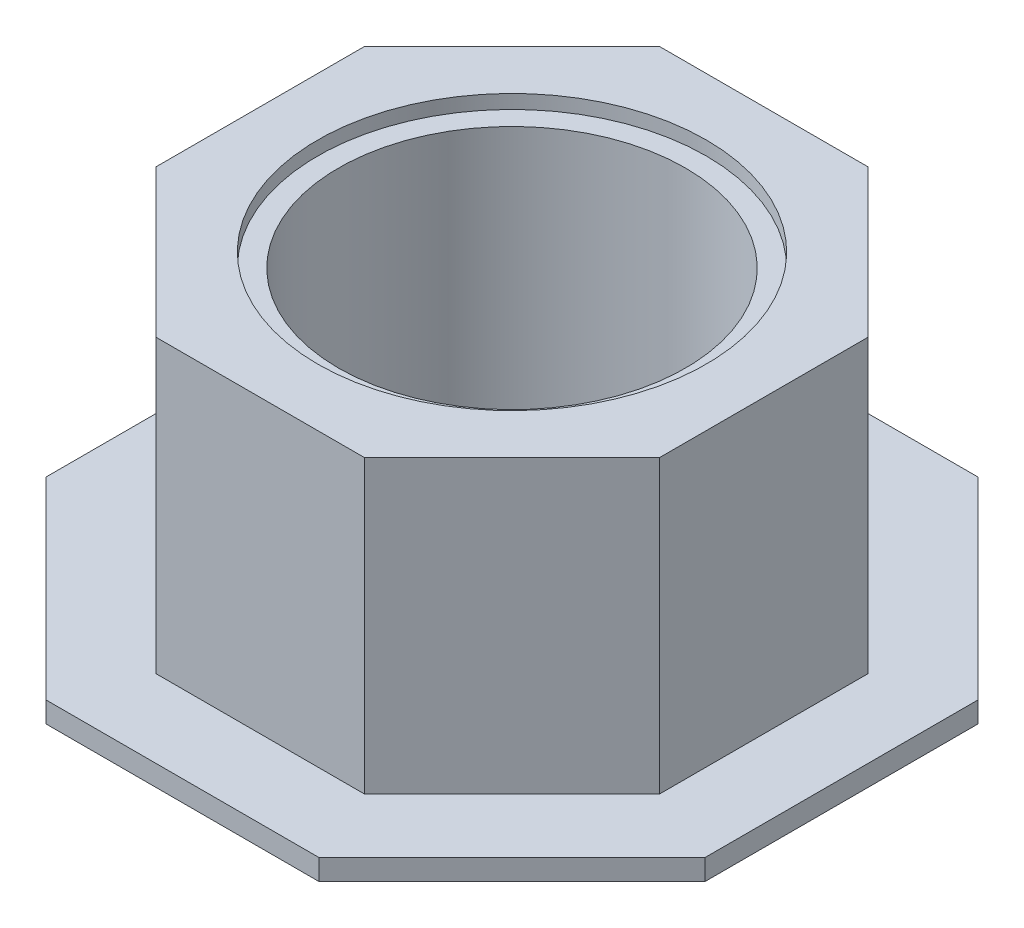
ISO-10303-21;
HEADER;
FILE_DESCRIPTION(('STEP AP214'),'2;1');
FILE_NAME('part.step','',(''),(''),'','','');
FILE_SCHEMA(('AUTOMOTIVE_DESIGN { 1 0 10303 214 1 1 1 1 }'));
ENDSEC;
DATA;
#1=APPLICATION_CONTEXT('core data for automotive mechanical design processes');
#2=APPLICATION_PROTOCOL_DEFINITION('international standard','automotive_design',2000,#1);
#3=PRODUCT_CONTEXT('',#1,'mechanical');
#4=PRODUCT('Part','Part','',(#3));
#5=PRODUCT_RELATED_PRODUCT_CATEGORY('part','',(#4));
#6=PRODUCT_DEFINITION_FORMATION('','',#4);
#7=PRODUCT_DEFINITION_CONTEXT('part definition',#1,'design');
#8=PRODUCT_DEFINITION('design','',#6,#7);
#9=PRODUCT_DEFINITION_SHAPE('','',#8);
#10=(LENGTH_UNIT() NAMED_UNIT(*) SI_UNIT(.MILLI.,.METRE.));
#11=(NAMED_UNIT(*) PLANE_ANGLE_UNIT() SI_UNIT($,.RADIAN.));
#12=(NAMED_UNIT(*) SI_UNIT($,.STERADIAN.) SOLID_ANGLE_UNIT());
#13=UNCERTAINTY_MEASURE_WITH_UNIT(LENGTH_MEASURE(1.E-05),#10,'distance_accuracy_value','');
#14=(GEOMETRIC_REPRESENTATION_CONTEXT(3) GLOBAL_UNCERTAINTY_ASSIGNED_CONTEXT((#13)) GLOBAL_UNIT_ASSIGNED_CONTEXT((#10,
#11,#12)) REPRESENTATION_CONTEXT('',''));
#15=CARTESIAN_POINT('',(0.,0.,0.));
#16=DIRECTION('',(0.,0.,1.));
#17=DIRECTION('',(1.,0.,0.));
#18=AXIS2_PLACEMENT_3D('',#15,#16,#17);
#19=CARTESIAN_POINT('',(0.,0.,0.));
#20=DIRECTION('',(0.,1.,0.));
#21=DIRECTION('',(0.,0.,1.));
#22=AXIS2_PLACEMENT_3D('',#19,#20,#21);
#23=PLANE('',#22);
#24=DIRECTION('',(1.,0.,0.));
#25=VECTOR('',#24,1.);
#26=CARTESIAN_POINT('',(-39.35,0.,94.9993036793813));
#27=LINE('',#26,#25);
#28=CARTESIAN_POINT('',(-39.35,0.,94.9993036793813));
#29=VERTEX_POINT('',#28);
#30=CARTESIAN_POINT('',(39.35,0.,94.9993036793813));
#31=VERTEX_POINT('',#30);
#32=EDGE_CURVE('E157',#29,#31,#27,.T.);
#33=ORIENTED_EDGE('',*,*,#32,.T.);
#34=DIRECTION('',(0.707106781186547,0.,-0.707106781186548));
#35=VECTOR('',#34,1.);
#36=CARTESIAN_POINT('',(39.35,0.,94.9993036793813));
#37=LINE('',#36,#35);
#38=CARTESIAN_POINT('',(94.9993036793813,0.,39.35));
#39=VERTEX_POINT('',#38);
#40=EDGE_CURVE('E161',#31,#39,#37,.T.);
#41=ORIENTED_EDGE('',*,*,#40,.T.);
#42=DIRECTION('',(0.,0.,-1.));
#43=VECTOR('',#42,1.);
#44=CARTESIAN_POINT('',(94.9993036793813,0.,39.35));
#45=LINE('',#44,#43);
#46=CARTESIAN_POINT('',(94.9993036793813,0.,-39.35));
#47=VERTEX_POINT('',#46);
#48=EDGE_CURVE('E166',#39,#47,#45,.T.);
#49=ORIENTED_EDGE('',*,*,#48,.T.);
#50=DIRECTION('',(-0.707106781186548,0.,-0.707106781186547));
#51=VECTOR('',#50,1.);
#52=CARTESIAN_POINT('',(94.9993036793813,0.,-39.35));
#53=LINE('',#52,#51);
#54=CARTESIAN_POINT('',(39.35,0.,-94.9993036793813));
#55=VERTEX_POINT('',#54);
#56=EDGE_CURVE('E170',#47,#55,#53,.T.);
#57=ORIENTED_EDGE('',*,*,#56,.T.);
#58=DIRECTION('',(-1.,0.,0.));
#59=VECTOR('',#58,1.);
#60=CARTESIAN_POINT('',(39.35,0.,-94.9993036793813));
#61=LINE('',#60,#59);
#62=CARTESIAN_POINT('',(-39.35,0.,-94.9993036793813));
#63=VERTEX_POINT('',#62);
#64=EDGE_CURVE('E174',#55,#63,#61,.T.);
#65=ORIENTED_EDGE('',*,*,#64,.T.);
#66=DIRECTION('',(-0.707106781186548,0.,0.707106781186548));
#67=VECTOR('',#66,1.);
#68=CARTESIAN_POINT('',(-39.35,0.,-94.9993036793813));
#69=LINE('',#68,#67);
#70=CARTESIAN_POINT('',(-94.9993036793813,0.,-39.35));
#71=VERTEX_POINT('',#70);
#72=EDGE_CURVE('E178',#63,#71,#69,.T.);
#73=ORIENTED_EDGE('',*,*,#72,.T.);
#74=DIRECTION('',(0.,0.,1.));
#75=VECTOR('',#74,1.);
#76=CARTESIAN_POINT('',(-94.9993036793813,0.,-39.35));
#77=LINE('',#76,#75);
#78=CARTESIAN_POINT('',(-94.9993036793813,0.,39.35));
#79=VERTEX_POINT('',#78);
#80=EDGE_CURVE('E128',#71,#79,#77,.T.);
#81=ORIENTED_EDGE('',*,*,#80,.T.);
#82=DIRECTION('',(0.707106781186547,0.,0.707106781186547));
#83=VECTOR('',#82,1.);
#84=CARTESIAN_POINT('',(-94.9993036793813,0.,39.35));
#85=LINE('',#84,#83);
#86=EDGE_CURVE('E183',#79,#29,#85,.T.);
#87=ORIENTED_EDGE('',*,*,#86,.T.);
#88=EDGE_LOOP('',(#33,#41,#49,#57,#65,#73,#81,#87));
#89=FACE_BOUND('',#88,.T.);
#90=DIRECTION('',(1.,0.,0.));
#91=VECTOR('',#90,1.);
#92=CARTESIAN_POINT('',(0.,0.,72.59));
#93=LINE('',#92,#91);
#94=CARTESIAN_POINT('',(-30.067762492663,0.,72.59));
#95=VERTEX_POINT('',#94);
#96=CARTESIAN_POINT('',(30.067762492663,0.,72.59));
#97=VERTEX_POINT('',#96);
#98=EDGE_CURVE('E288',#95,#97,#93,.T.);
#99=ORIENTED_EDGE('',*,*,#98,.F.);
#100=DIRECTION('',(0.707106781186548,0.,0.707106781186547));
#101=VECTOR('',#100,1.);
#102=CARTESIAN_POINT('',(-51.3288812463315,0.,51.3288812463315));
#103=LINE('',#102,#101);
#104=CARTESIAN_POINT('',(-72.59,0.,30.067762492663));
#105=VERTEX_POINT('',#104);
#106=EDGE_CURVE('E249',#105,#95,#103,.T.);
#107=ORIENTED_EDGE('',*,*,#106,.F.);
#108=DIRECTION('',(0.,0.,1.));
#109=VECTOR('',#108,1.);
#110=CARTESIAN_POINT('',(-72.59,0.,0.));
#111=LINE('',#110,#109);
#112=CARTESIAN_POINT('',(-72.59,0.,-30.067762492663));
#113=VERTEX_POINT('',#112);
#114=EDGE_CURVE('E256',#113,#105,#111,.T.);
#115=ORIENTED_EDGE('',*,*,#114,.F.);
#116=DIRECTION('',(-0.707106781186547,0.,0.707106781186548));
#117=VECTOR('',#116,1.);
#118=CARTESIAN_POINT('',(-51.3288812463315,0.,-51.3288812463315));
#119=LINE('',#118,#117);
#120=CARTESIAN_POINT('',(-30.067762492663,0.,-72.59));
#121=VERTEX_POINT('',#120);
#122=EDGE_CURVE('E308',#121,#113,#119,.T.);
#123=ORIENTED_EDGE('',*,*,#122,.F.);
#124=DIRECTION('',(-1.,0.,0.));
#125=VECTOR('',#124,1.);
#126=CARTESIAN_POINT('',(0.,0.,-72.59));
#127=LINE('',#126,#125);
#128=CARTESIAN_POINT('',(30.0677624926629,0.,-72.59));
#129=VERTEX_POINT('',#128);
#130=EDGE_CURVE('E304',#129,#121,#127,.T.);
#131=ORIENTED_EDGE('',*,*,#130,.F.);
#132=DIRECTION('',(-0.707106781186548,0.,-0.707106781186548));
#133=VECTOR('',#132,1.);
#134=CARTESIAN_POINT('',(51.3288812463315,0.,-51.3288812463315));
#135=LINE('',#134,#133);
#136=CARTESIAN_POINT('',(72.59,0.,-30.067762492663));
#137=VERTEX_POINT('',#136);
#138=EDGE_CURVE('E300',#137,#129,#135,.T.);
#139=ORIENTED_EDGE('',*,*,#138,.F.);
#140=DIRECTION('',(0.,0.,-1.));
#141=VECTOR('',#140,1.);
#142=CARTESIAN_POINT('',(72.59,0.,0.));
#143=LINE('',#142,#141);
#144=CARTESIAN_POINT('',(72.59,0.,30.067762492663));
#145=VERTEX_POINT('',#144);
#146=EDGE_CURVE('E296',#145,#137,#143,.T.);
#147=ORIENTED_EDGE('',*,*,#146,.F.);
#148=DIRECTION('',(0.707106781186547,0.,-0.707106781186548));
#149=VECTOR('',#148,1.);
#150=CARTESIAN_POINT('',(51.3288812463315,0.,51.3288812463315));
#151=LINE('',#150,#149);
#152=EDGE_CURVE('E292',#97,#145,#151,.T.);
#153=ORIENTED_EDGE('',*,*,#152,.F.);
#154=EDGE_LOOP('',(#99,#107,#115,#123,#131,#139,#147,#153));
#155=FACE_BOUND('',#154,.T.);
#156=ADVANCED_FACE('F39',(#89,#155),#23,.T.);
#157=CARTESIAN_POINT('',(-39.35,-6.,94.9993036793813));
#158=DIRECTION('',(0.,0.,1.));
#159=DIRECTION('',(1.,0.,0.));
#160=AXIS2_PLACEMENT_3D('',#157,#158,#159);
#161=PLANE('',#160);
#162=ORIENTED_EDGE('',*,*,#32,.F.);
#163=DIRECTION('',(0.,1.,0.));
#164=VECTOR('',#163,1.);
#165=CARTESIAN_POINT('',(-39.35,-6.,94.9993036793813));
#166=LINE('',#165,#164);
#167=CARTESIAN_POINT('',(-39.35,-6.,94.9993036793813));
#168=VERTEX_POINT('',#167);
#169=EDGE_CURVE('E48',#168,#29,#166,.T.);
#170=ORIENTED_EDGE('',*,*,#169,.F.);
#171=DIRECTION('',(1.,0.,0.));
#172=VECTOR('',#171,1.);
#173=CARTESIAN_POINT('',(-39.35,-6.,94.9993036793813));
#174=LINE('',#173,#172);
#175=CARTESIAN_POINT('',(39.35,-6.,94.9993036793813));
#176=VERTEX_POINT('',#175);
#177=EDGE_CURVE('E187',#168,#176,#174,.T.);
#178=ORIENTED_EDGE('',*,*,#177,.T.);
#179=DIRECTION('',(0.,1.,0.));
#180=VECTOR('',#179,1.);
#181=CARTESIAN_POINT('',(39.35,-6.,94.9993036793813));
#182=LINE('',#181,#180);
#183=EDGE_CURVE('E102',#176,#31,#182,.T.);
#184=ORIENTED_EDGE('',*,*,#183,.T.);
#185=EDGE_LOOP('',(#162,#170,#178,#184));
#186=FACE_BOUND('',#185,.T.);
#187=ADVANCED_FACE('F41',(#186),#161,.T.);
#188=CARTESIAN_POINT('',(-94.9993036793813,-6.,39.35));
#189=DIRECTION('',(-0.707106781186548,0.,0.707106781186548));
#190=DIRECTION('',(0.707106781186548,0.,0.707106781186548));
#191=AXIS2_PLACEMENT_3D('',#188,#189,#190);
#192=PLANE('',#191);
#193=ORIENTED_EDGE('',*,*,#86,.F.);
#194=DIRECTION('',(0.,1.,0.));
#195=VECTOR('',#194,1.);
#196=CARTESIAN_POINT('',(-94.9993036793813,-6.,39.35));
#197=LINE('',#196,#195);
#198=CARTESIAN_POINT('',(-94.9993036793813,-6.,39.35));
#199=VERTEX_POINT('',#198);
#200=EDGE_CURVE('E134',#199,#79,#197,.T.);
#201=ORIENTED_EDGE('',*,*,#200,.F.);
#202=DIRECTION('',(0.707106781186547,0.,0.707106781186547));
#203=VECTOR('',#202,1.);
#204=CARTESIAN_POINT('',(-94.9993036793813,-6.,39.35));
#205=LINE('',#204,#203);
#206=EDGE_CURVE('E143',#199,#168,#205,.T.);
#207=ORIENTED_EDGE('',*,*,#206,.T.);
#208=ORIENTED_EDGE('',*,*,#169,.T.);
#209=EDGE_LOOP('',(#193,#201,#207,#208));
#210=FACE_BOUND('',#209,.T.);
#211=ADVANCED_FACE('F207',(#210),#192,.T.);
#212=CARTESIAN_POINT('',(-94.9993036793813,-6.,-39.35));
#213=DIRECTION('',(-1.,0.,0.));
#214=DIRECTION('',(0.,0.,1.));
#215=AXIS2_PLACEMENT_3D('',#212,#213,#214);
#216=PLANE('',#215);
#217=ORIENTED_EDGE('',*,*,#80,.F.);
#218=DIRECTION('',(0.,1.,0.));
#219=VECTOR('',#218,1.);
#220=CARTESIAN_POINT('',(-94.9993036793813,-6.,-39.35));
#221=LINE('',#220,#219);
#222=CARTESIAN_POINT('',(-94.9993036793813,-6.,-39.35));
#223=VERTEX_POINT('',#222);
#224=EDGE_CURVE('E122',#223,#71,#221,.T.);
#225=ORIENTED_EDGE('',*,*,#224,.F.);
#226=DIRECTION('',(0.,0.,1.));
#227=VECTOR('',#226,1.);
#228=CARTESIAN_POINT('',(-94.9993036793813,-6.,-39.35));
#229=LINE('',#228,#227);
#230=EDGE_CURVE('E125',#223,#199,#229,.T.);
#231=ORIENTED_EDGE('',*,*,#230,.T.);
#232=ORIENTED_EDGE('',*,*,#200,.T.);
#233=EDGE_LOOP('',(#217,#225,#231,#232));
#234=FACE_BOUND('',#233,.T.);
#235=ADVANCED_FACE('F124',(#234),#216,.T.);
#236=CARTESIAN_POINT('',(-39.35,-6.,-94.9993036793813));
#237=DIRECTION('',(-0.707106781186547,0.,-0.707106781186547));
#238=DIRECTION('',(-0.707106781186548,0.,0.707106781186548));
#239=AXIS2_PLACEMENT_3D('',#236,#237,#238);
#240=PLANE('',#239);
#241=ORIENTED_EDGE('',*,*,#72,.F.);
#242=DIRECTION('',(0.,1.,0.));
#243=VECTOR('',#242,1.);
#244=CARTESIAN_POINT('',(-39.35,-6.,-94.9993036793813));
#245=LINE('',#244,#243);
#246=CARTESIAN_POINT('',(-39.35,-6.,-94.9993036793813));
#247=VERTEX_POINT('',#246);
#248=EDGE_CURVE('E135',#247,#63,#245,.T.);
#249=ORIENTED_EDGE('',*,*,#248,.F.);
#250=DIRECTION('',(-0.707106781186548,0.,0.707106781186548));
#251=VECTOR('',#250,1.);
#252=CARTESIAN_POINT('',(-39.35,-6.,-94.9993036793813));
#253=LINE('',#252,#251);
#254=EDGE_CURVE('E141',#247,#223,#253,.T.);
#255=ORIENTED_EDGE('',*,*,#254,.T.);
#256=ORIENTED_EDGE('',*,*,#224,.T.);
#257=EDGE_LOOP('',(#241,#249,#255,#256));
#258=FACE_BOUND('',#257,.T.);
#259=ADVANCED_FACE('F146',(#258),#240,.T.);
#260=CARTESIAN_POINT('',(39.35,-6.,-94.9993036793813));
#261=DIRECTION('',(0.,0.,-1.));
#262=DIRECTION('',(-1.,0.,0.));
#263=AXIS2_PLACEMENT_3D('',#260,#261,#262);
#264=PLANE('',#263);
#265=ORIENTED_EDGE('',*,*,#64,.F.);
#266=DIRECTION('',(0.,1.,0.));
#267=VECTOR('',#266,1.);
#268=CARTESIAN_POINT('',(39.35,-6.,-94.9993036793813));
#269=LINE('',#268,#267);
#270=CARTESIAN_POINT('',(39.35,-6.,-94.9993036793813));
#271=VERTEX_POINT('',#270);
#272=EDGE_CURVE('E194',#271,#55,#269,.T.);
#273=ORIENTED_EDGE('',*,*,#272,.F.);
#274=DIRECTION('',(-1.,0.,0.));
#275=VECTOR('',#274,1.);
#276=CARTESIAN_POINT('',(39.35,-6.,-94.9993036793813));
#277=LINE('',#276,#275);
#278=EDGE_CURVE('E148',#271,#247,#277,.T.);
#279=ORIENTED_EDGE('',*,*,#278,.T.);
#280=ORIENTED_EDGE('',*,*,#248,.T.);
#281=EDGE_LOOP('',(#265,#273,#279,#280));
#282=FACE_BOUND('',#281,.T.);
#283=ADVANCED_FACE('F360',(#282),#264,.T.);
#284=CARTESIAN_POINT('',(94.9993036793813,-6.,-39.35));
#285=DIRECTION('',(0.707106781186547,0.,-0.707106781186548));
#286=DIRECTION('',(-0.707106781186548,0.,-0.707106781186547));
#287=AXIS2_PLACEMENT_3D('',#284,#285,#286);
#288=PLANE('',#287);
#289=ORIENTED_EDGE('',*,*,#56,.F.);
#290=DIRECTION('',(0.,1.,0.));
#291=VECTOR('',#290,1.);
#292=CARTESIAN_POINT('',(94.9993036793813,-6.,-39.35));
#293=LINE('',#292,#291);
#294=CARTESIAN_POINT('',(94.9993036793813,-6.,-39.35));
#295=VERTEX_POINT('',#294);
#296=EDGE_CURVE('E197',#295,#47,#293,.T.);
#297=ORIENTED_EDGE('',*,*,#296,.F.);
#298=DIRECTION('',(-0.707106781186548,0.,-0.707106781186547));
#299=VECTOR('',#298,1.);
#300=CARTESIAN_POINT('',(94.9993036793813,-6.,-39.35));
#301=LINE('',#300,#299);
#302=EDGE_CURVE('E151',#295,#271,#301,.T.);
#303=ORIENTED_EDGE('',*,*,#302,.T.);
#304=ORIENTED_EDGE('',*,*,#272,.T.);
#305=EDGE_LOOP('',(#289,#297,#303,#304));
#306=FACE_BOUND('',#305,.T.);
#307=ADVANCED_FACE('F354',(#306),#288,.T.);
#308=CARTESIAN_POINT('',(94.9993036793813,-6.,39.35));
#309=DIRECTION('',(1.,0.,0.));
#310=DIRECTION('',(0.,0.,-1.));
#311=AXIS2_PLACEMENT_3D('',#308,#309,#310);
#312=PLANE('',#311);
#313=ORIENTED_EDGE('',*,*,#48,.F.);
#314=DIRECTION('',(0.,1.,0.));
#315=VECTOR('',#314,1.);
#316=CARTESIAN_POINT('',(94.9993036793813,-6.,39.35));
#317=LINE('',#316,#315);
#318=CARTESIAN_POINT('',(94.9993036793813,-6.,39.35));
#319=VERTEX_POINT('',#318);
#320=EDGE_CURVE('E200',#319,#39,#317,.T.);
#321=ORIENTED_EDGE('',*,*,#320,.F.);
#322=DIRECTION('',(0.,0.,-1.));
#323=VECTOR('',#322,1.);
#324=CARTESIAN_POINT('',(94.9993036793813,-6.,39.35));
#325=LINE('',#324,#323);
#326=EDGE_CURVE('E346',#319,#295,#325,.T.);
#327=ORIENTED_EDGE('',*,*,#326,.T.);
#328=ORIENTED_EDGE('',*,*,#296,.T.);
#329=EDGE_LOOP('',(#313,#321,#327,#328));
#330=FACE_BOUND('',#329,.T.);
#331=ADVANCED_FACE('F358',(#330),#312,.T.);
#332=CARTESIAN_POINT('',(39.35,-6.,94.9993036793813));
#333=DIRECTION('',(0.707106781186548,0.,0.707106781186547));
#334=DIRECTION('',(0.707106781186547,0.,-0.707106781186548));
#335=AXIS2_PLACEMENT_3D('',#332,#333,#334);
#336=PLANE('',#335);
#337=ORIENTED_EDGE('',*,*,#40,.F.);
#338=ORIENTED_EDGE('',*,*,#183,.F.);
#339=DIRECTION('',(0.707106781186547,0.,-0.707106781186548));
#340=VECTOR('',#339,1.);
#341=CARTESIAN_POINT('',(39.35,-6.,94.9993036793813));
#342=LINE('',#341,#340);
#343=EDGE_CURVE('E343',#176,#319,#342,.T.);
#344=ORIENTED_EDGE('',*,*,#343,.T.);
#345=ORIENTED_EDGE('',*,*,#320,.T.);
#346=EDGE_LOOP('',(#337,#338,#344,#345));
#347=FACE_BOUND('',#346,.T.);
#348=ADVANCED_FACE('F203',(#347),#336,.T.);
#349=CARTESIAN_POINT('',(0.,-6.,0.));
#350=DIRECTION('',(0.,1.,0.));
#351=DIRECTION('',(0.,0.,1.));
#352=AXIS2_PLACEMENT_3D('',#349,#350,#351);
#353=PLANE('',#352);
#354=ORIENTED_EDGE('',*,*,#177,.F.);
#355=ORIENTED_EDGE('',*,*,#206,.F.);
#356=ORIENTED_EDGE('',*,*,#230,.F.);
#357=ORIENTED_EDGE('',*,*,#254,.F.);
#358=ORIENTED_EDGE('',*,*,#278,.F.);
#359=ORIENTED_EDGE('',*,*,#302,.F.);
#360=ORIENTED_EDGE('',*,*,#326,.F.);
#361=ORIENTED_EDGE('',*,*,#343,.F.);
#362=EDGE_LOOP('',(#354,#355,#356,#357,#358,#359,#360,#361));
#363=FACE_BOUND('',#362,.T.);
#364=ADVANCED_FACE('F139',(#363),#353,.F.);
#365=CARTESIAN_POINT('',(-51.3288812463315,84.,51.3288812463315));
#366=DIRECTION('',(0.707106781186547,0.,-0.707106781186547));
#367=DIRECTION('',(-0.707106781186548,0.,-0.707106781186548));
#368=AXIS2_PLACEMENT_3D('',#365,#366,#367);
#369=PLANE('',#368);
#370=ORIENTED_EDGE('',*,*,#106,.T.);
#371=DIRECTION('',(0.,-1.,0.));
#372=VECTOR('',#371,1.);
#373=CARTESIAN_POINT('',(-30.067762492663,84.,72.59));
#374=LINE('',#373,#372);
#375=CARTESIAN_POINT('',(-30.067762492663,84.,72.59));
#376=VERTEX_POINT('',#375);
#377=EDGE_CURVE('E162',#376,#95,#374,.T.);
#378=ORIENTED_EDGE('',*,*,#377,.F.);
#379=DIRECTION('',(0.707106781186548,0.,0.707106781186547));
#380=VECTOR('',#379,1.);
#381=CARTESIAN_POINT('',(-51.3288812463315,84.,51.3288812463315));
#382=LINE('',#381,#380);
#383=CARTESIAN_POINT('',(-72.59,84.,30.067762492663));
#384=VERTEX_POINT('',#383);
#385=EDGE_CURVE('E251',#384,#376,#382,.T.);
#386=ORIENTED_EDGE('',*,*,#385,.F.);
#387=DIRECTION('',(0.,-1.,0.));
#388=VECTOR('',#387,1.);
#389=CARTESIAN_POINT('',(-72.59,84.,30.067762492663));
#390=LINE('',#389,#388);
#391=EDGE_CURVE('E284',#384,#105,#390,.T.);
#392=ORIENTED_EDGE('',*,*,#391,.T.);
#393=EDGE_LOOP('',(#370,#378,#386,#392));
#394=FACE_BOUND('',#393,.T.);
#395=ADVANCED_FACE('F375',(#394),#369,.F.);
#396=CARTESIAN_POINT('',(0.,84.,72.59));
#397=DIRECTION('',(0.,0.,-1.));
#398=DIRECTION('',(-1.,0.,0.));
#399=AXIS2_PLACEMENT_3D('',#396,#397,#398);
#400=PLANE('',#399);
#401=ORIENTED_EDGE('',*,*,#98,.T.);
#402=DIRECTION('',(0.,-1.,0.));
#403=VECTOR('',#402,1.);
#404=CARTESIAN_POINT('',(30.067762492663,84.,72.59));
#405=LINE('',#404,#403);
#406=CARTESIAN_POINT('',(30.067762492663,84.,72.59));
#407=VERTEX_POINT('',#406);
#408=EDGE_CURVE('E334',#407,#97,#405,.T.);
#409=ORIENTED_EDGE('',*,*,#408,.F.);
#410=DIRECTION('',(1.,0.,0.));
#411=VECTOR('',#410,1.);
#412=CARTESIAN_POINT('',(0.,84.,72.59));
#413=LINE('',#412,#411);
#414=EDGE_CURVE('E255',#376,#407,#413,.T.);
#415=ORIENTED_EDGE('',*,*,#414,.F.);
#416=ORIENTED_EDGE('',*,*,#377,.T.);
#417=EDGE_LOOP('',(#401,#409,#415,#416));
#418=FACE_BOUND('',#417,.T.);
#419=ADVANCED_FACE('F379',(#418),#400,.F.);
#420=CARTESIAN_POINT('',(51.3288812463315,84.,51.3288812463315));
#421=DIRECTION('',(-0.707106781186548,0.,-0.707106781186547));
#422=DIRECTION('',(-0.707106781186547,0.,0.707106781186548));
#423=AXIS2_PLACEMENT_3D('',#420,#421,#422);
#424=PLANE('',#423);
#425=ORIENTED_EDGE('',*,*,#152,.T.);
#426=DIRECTION('',(0.,-1.,0.));
#427=VECTOR('',#426,1.);
#428=CARTESIAN_POINT('',(72.59,84.,30.067762492663));
#429=LINE('',#428,#427);
#430=CARTESIAN_POINT('',(72.59,84.,30.067762492663));
#431=VERTEX_POINT('',#430);
#432=EDGE_CURVE('E330',#431,#145,#429,.T.);
#433=ORIENTED_EDGE('',*,*,#432,.F.);
#434=DIRECTION('',(0.707106781186547,0.,-0.707106781186548));
#435=VECTOR('',#434,1.);
#436=CARTESIAN_POINT('',(51.3288812463315,84.,51.3288812463315));
#437=LINE('',#436,#435);
#438=EDGE_CURVE('E260',#407,#431,#437,.T.);
#439=ORIENTED_EDGE('',*,*,#438,.F.);
#440=ORIENTED_EDGE('',*,*,#408,.T.);
#441=EDGE_LOOP('',(#425,#433,#439,#440));
#442=FACE_BOUND('',#441,.T.);
#443=ADVANCED_FACE('F385',(#442),#424,.F.);
#444=CARTESIAN_POINT('',(72.59,84.,0.));
#445=DIRECTION('',(-1.,0.,0.));
#446=DIRECTION('',(0.,0.,1.));
#447=AXIS2_PLACEMENT_3D('',#444,#445,#446);
#448=PLANE('',#447);
#449=ORIENTED_EDGE('',*,*,#146,.T.);
#450=DIRECTION('',(0.,-1.,0.));
#451=VECTOR('',#450,1.);
#452=CARTESIAN_POINT('',(72.59,84.,-30.067762492663));
#453=LINE('',#452,#451);
#454=CARTESIAN_POINT('',(72.59,84.,-30.067762492663));
#455=VERTEX_POINT('',#454);
#456=EDGE_CURVE('E326',#455,#137,#453,.T.);
#457=ORIENTED_EDGE('',*,*,#456,.F.);
#458=DIRECTION('',(0.,0.,-1.));
#459=VECTOR('',#458,1.);
#460=CARTESIAN_POINT('',(72.59,84.,0.));
#461=LINE('',#460,#459);
#462=EDGE_CURVE('E264',#431,#455,#461,.T.);
#463=ORIENTED_EDGE('',*,*,#462,.F.);
#464=ORIENTED_EDGE('',*,*,#432,.T.);
#465=EDGE_LOOP('',(#449,#457,#463,#464));
#466=FACE_BOUND('',#465,.T.);
#467=ADVANCED_FACE('F389',(#466),#448,.F.);
#468=CARTESIAN_POINT('',(51.3288812463315,84.,-51.3288812463315));
#469=DIRECTION('',(-0.707106781186547,0.,0.707106781186547));
#470=DIRECTION('',(0.707106781186548,0.,0.707106781186548));
#471=AXIS2_PLACEMENT_3D('',#468,#469,#470);
#472=PLANE('',#471);
#473=ORIENTED_EDGE('',*,*,#138,.T.);
#474=DIRECTION('',(0.,-1.,0.));
#475=VECTOR('',#474,1.);
#476=CARTESIAN_POINT('',(30.0677624926629,84.,-72.59));
#477=LINE('',#476,#475);
#478=CARTESIAN_POINT('',(30.0677624926629,84.,-72.59));
#479=VERTEX_POINT('',#478);
#480=EDGE_CURVE('E322',#479,#129,#477,.T.);
#481=ORIENTED_EDGE('',*,*,#480,.F.);
#482=DIRECTION('',(-0.707106781186548,0.,-0.707106781186548));
#483=VECTOR('',#482,1.);
#484=CARTESIAN_POINT('',(51.3288812463315,84.,-51.3288812463315));
#485=LINE('',#484,#483);
#486=EDGE_CURVE('E268',#455,#479,#485,.T.);
#487=ORIENTED_EDGE('',*,*,#486,.F.);
#488=ORIENTED_EDGE('',*,*,#456,.T.);
#489=EDGE_LOOP('',(#473,#481,#487,#488));
#490=FACE_BOUND('',#489,.T.);
#491=ADVANCED_FACE('F393',(#490),#472,.F.);
#492=CARTESIAN_POINT('',(0.,84.,-72.59));
#493=DIRECTION('',(0.,0.,1.));
#494=DIRECTION('',(1.,0.,0.));
#495=AXIS2_PLACEMENT_3D('',#492,#493,#494);
#496=PLANE('',#495);
#497=ORIENTED_EDGE('',*,*,#130,.T.);
#498=DIRECTION('',(0.,-1.,0.));
#499=VECTOR('',#498,1.);
#500=CARTESIAN_POINT('',(-30.067762492663,84.,-72.59));
#501=LINE('',#500,#499);
#502=CARTESIAN_POINT('',(-30.067762492663,84.,-72.59));
#503=VERTEX_POINT('',#502);
#504=EDGE_CURVE('E318',#503,#121,#501,.T.);
#505=ORIENTED_EDGE('',*,*,#504,.F.);
#506=DIRECTION('',(-1.,0.,0.));
#507=VECTOR('',#506,1.);
#508=CARTESIAN_POINT('',(0.,84.,-72.59));
#509=LINE('',#508,#507);
#510=EDGE_CURVE('E272',#479,#503,#509,.T.);
#511=ORIENTED_EDGE('',*,*,#510,.F.);
#512=ORIENTED_EDGE('',*,*,#480,.T.);
#513=EDGE_LOOP('',(#497,#505,#511,#512));
#514=FACE_BOUND('',#513,.T.);
#515=ADVANCED_FACE('F397',(#514),#496,.F.);
#516=CARTESIAN_POINT('',(-51.3288812463315,84.,-51.3288812463315));
#517=DIRECTION('',(0.707106781186548,0.,0.707106781186547));
#518=DIRECTION('',(0.707106781186547,0.,-0.707106781186548));
#519=AXIS2_PLACEMENT_3D('',#516,#517,#518);
#520=PLANE('',#519);
#521=ORIENTED_EDGE('',*,*,#122,.T.);
#522=DIRECTION('',(0.,-1.,0.));
#523=VECTOR('',#522,1.);
#524=CARTESIAN_POINT('',(-72.59,84.,-30.067762492663));
#525=LINE('',#524,#523);
#526=CARTESIAN_POINT('',(-72.59,84.,-30.067762492663));
#527=VERTEX_POINT('',#526);
#528=EDGE_CURVE('E55',#527,#113,#525,.T.);
#529=ORIENTED_EDGE('',*,*,#528,.F.);
#530=DIRECTION('',(-0.707106781186547,0.,0.707106781186548));
#531=VECTOR('',#530,1.);
#532=CARTESIAN_POINT('',(-51.3288812463315,84.,-51.3288812463315));
#533=LINE('',#532,#531);
#534=EDGE_CURVE('E276',#503,#527,#533,.T.);
#535=ORIENTED_EDGE('',*,*,#534,.F.);
#536=ORIENTED_EDGE('',*,*,#504,.T.);
#537=EDGE_LOOP('',(#521,#529,#535,#536));
#538=FACE_BOUND('',#537,.T.);
#539=ADVANCED_FACE('F401',(#538),#520,.F.);
#540=CARTESIAN_POINT('',(-72.59,84.,0.));
#541=DIRECTION('',(1.,0.,0.));
#542=DIRECTION('',(0.,0.,-1.));
#543=AXIS2_PLACEMENT_3D('',#540,#541,#542);
#544=PLANE('',#543);
#545=ORIENTED_EDGE('',*,*,#114,.T.);
#546=ORIENTED_EDGE('',*,*,#391,.F.);
#547=DIRECTION('',(0.,0.,1.));
#548=VECTOR('',#547,1.);
#549=CARTESIAN_POINT('',(-72.59,84.,0.));
#550=LINE('',#549,#548);
#551=EDGE_CURVE('E280',#527,#384,#550,.T.);
#552=ORIENTED_EDGE('',*,*,#551,.F.);
#553=ORIENTED_EDGE('',*,*,#528,.T.);
#554=EDGE_LOOP('',(#545,#546,#552,#553));
#555=FACE_BOUND('',#554,.T.);
#556=ADVANCED_FACE('F405',(#555),#544,.F.);
#557=CARTESIAN_POINT('',(0.,84.,0.));
#558=DIRECTION('',(0.,1.,0.));
#559=DIRECTION('',(0.,0.,1.));
#560=AXIS2_PLACEMENT_3D('',#557,#558,#559);
#561=PLANE('',#560);
#562=CARTESIAN_POINT('',(0.,84.,0.));
#563=DIRECTION('',(0.,1.,0.));
#564=DIRECTION('',(0.,0.,1.));
#565=AXIS2_PLACEMENT_3D('',#562,#563,#564);
#566=CIRCLE('',#565,56.);
#567=CARTESIAN_POINT('',(0.,84.,56.));
#568=VERTEX_POINT('',#567);
#569=EDGE_CURVE('E240',#568,#568,#566,.T.);
#570=ORIENTED_EDGE('',*,*,#569,.F.);
#571=EDGE_LOOP('',(#570));
#572=FACE_BOUND('',#571,.T.);
#573=ORIENTED_EDGE('',*,*,#385,.T.);
#574=ORIENTED_EDGE('',*,*,#414,.T.);
#575=ORIENTED_EDGE('',*,*,#438,.T.);
#576=ORIENTED_EDGE('',*,*,#462,.T.);
#577=ORIENTED_EDGE('',*,*,#486,.T.);
#578=ORIENTED_EDGE('',*,*,#510,.T.);
#579=ORIENTED_EDGE('',*,*,#534,.T.);
#580=ORIENTED_EDGE('',*,*,#551,.T.);
#581=EDGE_LOOP('',(#573,#574,#575,#576,#577,#578,#579,#580));
#582=FACE_BOUND('',#581,.T.);
#583=ADVANCED_FACE('F409',(#572,#582),#561,.T.);
#584=CARTESIAN_POINT('',(0.,80.,0.));
#585=DIRECTION('',(0.,1.,0.));
#586=DIRECTION('',(0.,0.,1.));
#587=AXIS2_PLACEMENT_3D('',#584,#585,#586);
#588=CYLINDRICAL_SURFACE('',#587,56.);
#589=CARTESIAN_POINT('',(0.,80.,0.));
#590=DIRECTION('',(0.,1.,0.));
#591=DIRECTION('',(0.,0.,1.));
#592=AXIS2_PLACEMENT_3D('',#589,#590,#591);
#593=CIRCLE('',#592,56.);
#594=CARTESIAN_POINT('',(0.,80.,56.));
#595=VERTEX_POINT('',#594);
#596=EDGE_CURVE('E244',#595,#595,#593,.T.);
#597=ORIENTED_EDGE('',*,*,#596,.F.);
#598=EDGE_LOOP('',(#597));
#599=FACE_BOUND('',#598,.T.);
#600=ORIENTED_EDGE('',*,*,#569,.T.);
#601=EDGE_LOOP('',(#600));
#602=FACE_BOUND('',#601,.T.);
#603=ADVANCED_FACE('F231',(#599,#602),#588,.F.);
#604=CARTESIAN_POINT('',(0.,80.,0.));
#605=DIRECTION('',(0.,1.,0.));
#606=DIRECTION('',(0.,0.,1.));
#607=AXIS2_PLACEMENT_3D('',#604,#605,#606);
#608=PLANE('',#607);
#609=CARTESIAN_POINT('',(0.,80.,0.));
#610=DIRECTION('',(0.,1.,0.));
#611=DIRECTION('',(0.,0.,1.));
#612=AXIS2_PLACEMENT_3D('',#609,#610,#611);
#613=CIRCLE('',#612,50.);
#614=CARTESIAN_POINT('',(0.,80.,-50.));
#615=VERTEX_POINT('',#614);
#616=EDGE_CURVE('E238',#615,#615,#613,.T.);
#617=ORIENTED_EDGE('',*,*,#616,.F.);
#618=EDGE_LOOP('',(#617));
#619=FACE_BOUND('',#618,.T.);
#620=ORIENTED_EDGE('',*,*,#596,.T.);
#621=EDGE_LOOP('',(#620));
#622=FACE_BOUND('',#621,.T.);
#623=ADVANCED_FACE('F223',(#619,#622),#608,.T.);
#624=CARTESIAN_POINT('',(0.,0.,0.));
#625=DIRECTION('',(0.,1.,0.));
#626=DIRECTION('',(0.,0.,1.));
#627=AXIS2_PLACEMENT_3D('',#624,#625,#626);
#628=CIRCLE('',#627,50.);
#629=CARTESIAN_POINT('',(0.,0.,-50.));
#630=VERTEX_POINT('',#629);
#631=EDGE_CURVE('E11',#630,#630,#628,.F.);
#632=ORIENTED_EDGE('',*,*,#631,.F.);
#633=EDGE_LOOP('',(#632));
#634=FACE_BOUND('',#633,.T.);
#635=ADVANCED_FACE('F217',(#634),#23,.T.);
#636=CARTESIAN_POINT('',(0.,84.,0.));
#637=DIRECTION('',(0.,-1.,0.));
#638=DIRECTION('',(0.,0.,-1.));
#639=AXIS2_PLACEMENT_3D('',#636,#637,#638);
#640=CYLINDRICAL_SURFACE('',#639,50.);
#641=CARTESIAN_POINT('',(0.,0.,-50.));
#642=CARTESIAN_POINT('',(0.,0.833333333333334,-50.));
#643=CARTESIAN_POINT('',(0.,1.66666666666667,-50.));
#644=CARTESIAN_POINT('',(0.,3.33333333333334,-50.));
#645=CARTESIAN_POINT('',(0.,4.16666666666667,-50.));
#646=CARTESIAN_POINT('',(0.,5.83333333333334,-50.));
#647=CARTESIAN_POINT('',(0.,6.66666666666667,-50.));
#648=CARTESIAN_POINT('',(0.,8.33333333333334,-50.));
#649=CARTESIAN_POINT('',(0.,9.16666666666667,-50.));
#650=CARTESIAN_POINT('',(0.,10.8333333333333,-50.));
#651=CARTESIAN_POINT('',(0.,11.6666666666667,-50.));
#652=CARTESIAN_POINT('',(0.,13.3333333333333,-50.));
#653=CARTESIAN_POINT('',(0.,14.1666666666667,-50.));
#654=CARTESIAN_POINT('',(0.,15.8333333333333,-50.));
#655=CARTESIAN_POINT('',(0.,16.6666666666667,-50.));
#656=CARTESIAN_POINT('',(0.,18.3333333333333,-50.));
#657=CARTESIAN_POINT('',(0.,19.1666666666667,-50.));
#658=CARTESIAN_POINT('',(0.,20.8333333333333,-50.));
#659=CARTESIAN_POINT('',(0.,21.6666666666667,-50.));
#660=CARTESIAN_POINT('',(0.,23.3333333333333,-50.));
#661=CARTESIAN_POINT('',(0.,24.1666666666667,-50.));
#662=CARTESIAN_POINT('',(0.,25.8333333333333,-50.));
#663=CARTESIAN_POINT('',(0.,26.6666666666667,-50.));
#664=CARTESIAN_POINT('',(0.,28.3333333333333,-50.));
#665=CARTESIAN_POINT('',(0.,29.1666666666667,-50.));
#666=CARTESIAN_POINT('',(0.,30.8333333333333,-50.));
#667=CARTESIAN_POINT('',(0.,31.6666666666667,-50.));
#668=CARTESIAN_POINT('',(0.,33.3333333333333,-50.));
#669=CARTESIAN_POINT('',(0.,34.1666666666667,-50.));
#670=CARTESIAN_POINT('',(0.,35.8333333333333,-50.));
#671=CARTESIAN_POINT('',(0.,36.6666666666667,-50.));
#672=CARTESIAN_POINT('',(0.,38.3333333333333,-50.));
#673=CARTESIAN_POINT('',(0.,39.1666666666667,-50.));
#674=CARTESIAN_POINT('',(0.,40.8333333333333,-50.));
#675=CARTESIAN_POINT('',(0.,41.6666666666667,-50.));
#676=CARTESIAN_POINT('',(0.,43.3333333333333,-50.));
#677=CARTESIAN_POINT('',(0.,44.1666666666667,-50.));
#678=CARTESIAN_POINT('',(0.,45.8333333333333,-50.));
#679=CARTESIAN_POINT('',(0.,46.6666666666667,-50.));
#680=CARTESIAN_POINT('',(0.,48.3333333333333,-50.));
#681=CARTESIAN_POINT('',(0.,49.1666666666667,-50.));
#682=CARTESIAN_POINT('',(0.,50.8333333333333,-50.));
#683=CARTESIAN_POINT('',(0.,51.6666666666667,-50.));
#684=CARTESIAN_POINT('',(0.,53.3333333333333,-50.));
#685=CARTESIAN_POINT('',(0.,54.1666666666667,-50.));
#686=CARTESIAN_POINT('',(0.,55.8333333333333,-50.));
#687=CARTESIAN_POINT('',(0.,56.6666666666667,-50.));
#688=CARTESIAN_POINT('',(0.,58.3333333333333,-50.));
#689=CARTESIAN_POINT('',(0.,59.1666666666667,-50.));
#690=CARTESIAN_POINT('',(0.,60.8333333333333,-50.));
#691=CARTESIAN_POINT('',(0.,61.6666666666667,-50.));
#692=CARTESIAN_POINT('',(0.,63.3333333333333,-50.));
#693=CARTESIAN_POINT('',(0.,64.1666666666667,-50.));
#694=CARTESIAN_POINT('',(0.,65.8333333333333,-50.));
#695=CARTESIAN_POINT('',(0.,66.6666666666667,-50.));
#696=CARTESIAN_POINT('',(0.,68.3333333333333,-50.));
#697=CARTESIAN_POINT('',(0.,69.1666666666667,-50.));
#698=CARTESIAN_POINT('',(0.,70.8333333333333,-50.));
#699=CARTESIAN_POINT('',(0.,71.6666666666667,-50.));
#700=CARTESIAN_POINT('',(0.,73.3333333333333,-50.));
#701=CARTESIAN_POINT('',(0.,74.1666666666667,-50.));
#702=CARTESIAN_POINT('',(0.,75.8333333333333,-50.));
#703=CARTESIAN_POINT('',(0.,76.6666666666667,-50.));
#704=CARTESIAN_POINT('',(0.,78.3333333333333,-50.));
#705=CARTESIAN_POINT('',(0.,79.1666666666667,-50.));
#706=CARTESIAN_POINT('',(0.,80.,-50.));
#707=B_SPLINE_CURVE_WITH_KNOTS('',3,(#641,#642,#643,#644,#645,#646,#647,#648,#649,#650,#651,
#652,#653,#654,#655,#656,#657,#658,#659,#660,#661,#662,#663,#664,#665,#666,#667,#668,#669,#670,
#671,#672,#673,#674,#675,#676,#677,#678,#679,#680,#681,#682,#683,#684,#685,#686,#687,#688,#689,
#690,#691,#692,#693,#694,#695,#696,#697,#698,#699,#700,#701,#702,#703,#704,#705,#706),
.UNSPECIFIED.,.F.,.F.,(4,2,2,2,2,2,2,2,2,2,2,2,2,2,2,2,2,2,2,2,2,2,2,2,2,2,2,2,2,2,2,2,4),(0.,
2.5,5.,7.50000000000001,10.,12.5,15.,17.5,20.,22.5,25.,27.5,30.,32.5,35.,37.5,40.,42.5,45.,47.5,
50.,52.5,55.,57.5,60.,62.5,65.,67.5,70.,72.5,75.,77.5,80.),.UNSPECIFIED.);
#708=EDGE_CURVE('BSEAM222',#630,#615,#707,.T.);
#709=ORIENTED_EDGE('',*,*,#631,.T.);
#710=ORIENTED_EDGE('',*,*,#616,.T.);
#711=ORIENTED_EDGE('',*,*,#708,.T.);
#712=ORIENTED_EDGE('',*,*,#708,.F.);
#713=EDGE_LOOP('',(#709,#711,#710,#712));
#714=FACE_BOUND('',#713,.T.);
#715=ADVANCED_FACE('F222',(#714),#640,.F.);
#716=CLOSED_SHELL('',(#156,#187,#211,#235,#259,#283,#307,#331,#348,#364,#395,#419,#443,#467,
#491,#515,#539,#556,#583,#603,#623,#635,#715));
#717=MANIFOLD_SOLID_BREP('B2',#716);
#718=ADVANCED_BREP_SHAPE_REPRESENTATION('',(#18,#717),#14);
#719=SHAPE_DEFINITION_REPRESENTATION(#9,#718);
ENDSEC;
END-ISO-10303-21;
